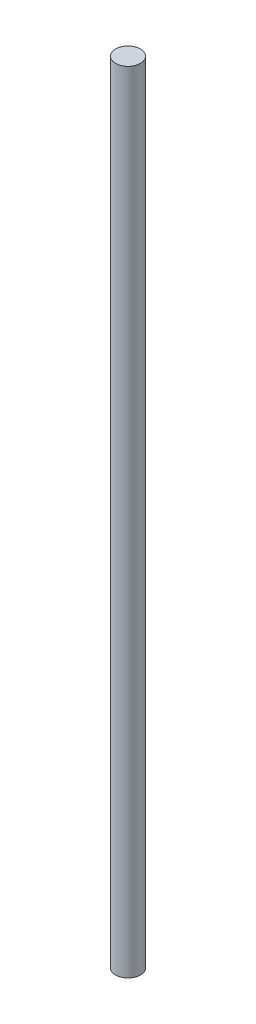
ISO-10303-21;
HEADER;
FILE_DESCRIPTION(('STEP AP214'),'2;1');
FILE_NAME('part.step','',(''),(''),'','','');
FILE_SCHEMA(('AUTOMOTIVE_DESIGN { 1 0 10303 214 1 1 1 1 }'));
ENDSEC;
DATA;
#1=APPLICATION_CONTEXT('core data for automotive mechanical design processes');
#2=APPLICATION_PROTOCOL_DEFINITION('international standard','automotive_design',2000,#1);
#3=PRODUCT_CONTEXT('',#1,'mechanical');
#4=PRODUCT('Part','Part','',(#3));
#5=PRODUCT_RELATED_PRODUCT_CATEGORY('part','',(#4));
#6=PRODUCT_DEFINITION_FORMATION('','',#4);
#7=PRODUCT_DEFINITION_CONTEXT('part definition',#1,'design');
#8=PRODUCT_DEFINITION('design','',#6,#7);
#9=PRODUCT_DEFINITION_SHAPE('','',#8);
#10=(LENGTH_UNIT() NAMED_UNIT(*) SI_UNIT(.MILLI.,.METRE.));
#11=(NAMED_UNIT(*) PLANE_ANGLE_UNIT() SI_UNIT($,.RADIAN.));
#12=(NAMED_UNIT(*) SI_UNIT($,.STERADIAN.) SOLID_ANGLE_UNIT());
#13=UNCERTAINTY_MEASURE_WITH_UNIT(LENGTH_MEASURE(1.E-05),#10,'distance_accuracy_value','');
#14=(GEOMETRIC_REPRESENTATION_CONTEXT(3) GLOBAL_UNCERTAINTY_ASSIGNED_CONTEXT((#13)) GLOBAL_UNIT_ASSIGNED_CONTEXT((#10,
#11,#12)) REPRESENTATION_CONTEXT('',''));
#15=CARTESIAN_POINT('',(0.,0.,0.));
#16=DIRECTION('',(0.,0.,1.));
#17=DIRECTION('',(1.,0.,0.));
#18=AXIS2_PLACEMENT_3D('',#15,#16,#17);
#19=CARTESIAN_POINT('',(0.,38.,0.));
#20=DIRECTION('',(0.,-1.,0.));
#21=DIRECTION('',(0.,0.,-1.));
#22=AXIS2_PLACEMENT_3D('',#19,#20,#21);
#23=CYLINDRICAL_SURFACE('',#22,0.6);
#24=CARTESIAN_POINT('',(0.,38.,0.));
#25=DIRECTION('',(0.,1.,0.));
#26=DIRECTION('',(0.,0.,1.));
#27=AXIS2_PLACEMENT_3D('',#24,#25,#26);
#28=CIRCLE('',#27,0.6);
#29=CARTESIAN_POINT('',(0.,38.,0.6));
#30=VERTEX_POINT('',#29);
#31=EDGE_CURVE('E10',#30,#30,#28,.T.);
#32=ORIENTED_EDGE('',*,*,#31,.F.);
#33=EDGE_LOOP('',(#32));
#34=FACE_BOUND('',#33,.T.);
#35=CARTESIAN_POINT('',(0.,0.,0.));
#36=DIRECTION('',(0.,1.,0.));
#37=DIRECTION('',(0.,0.,1.));
#38=AXIS2_PLACEMENT_3D('',#35,#36,#37);
#39=CIRCLE('',#38,0.6);
#40=CARTESIAN_POINT('',(0.,0.,0.6));
#41=VERTEX_POINT('',#40);
#42=EDGE_CURVE('E32',#41,#41,#39,.T.);
#43=ORIENTED_EDGE('',*,*,#42,.T.);
#44=EDGE_LOOP('',(#43));
#45=FACE_BOUND('',#44,.T.);
#46=ADVANCED_FACE('F29',(#34,#45),#23,.T.);
#47=CARTESIAN_POINT('',(0.,38.,0.));
#48=DIRECTION('',(0.,1.,0.));
#49=DIRECTION('',(0.,0.,1.));
#50=AXIS2_PLACEMENT_3D('',#47,#48,#49);
#51=PLANE('',#50);
#52=ORIENTED_EDGE('',*,*,#31,.T.);
#53=EDGE_LOOP('',(#52));
#54=FACE_BOUND('',#53,.T.);
#55=ADVANCED_FACE('F44',(#54),#51,.T.);
#56=CARTESIAN_POINT('',(0.,0.,0.));
#57=DIRECTION('',(0.,1.,0.));
#58=DIRECTION('',(0.,0.,1.));
#59=AXIS2_PLACEMENT_3D('',#56,#57,#58);
#60=PLANE('',#59);
#61=ORIENTED_EDGE('',*,*,#42,.F.);
#62=EDGE_LOOP('',(#61));
#63=FACE_BOUND('',#62,.T.);
#64=ADVANCED_FACE('F42',(#63),#60,.F.);
#65=CLOSED_SHELL('',(#46,#55,#64));
#66=MANIFOLD_SOLID_BREP('B2',#65);
#67=ADVANCED_BREP_SHAPE_REPRESENTATION('',(#18,#66),#14);
#68=SHAPE_DEFINITION_REPRESENTATION(#9,#67);
ENDSEC;
END-ISO-10303-21;
